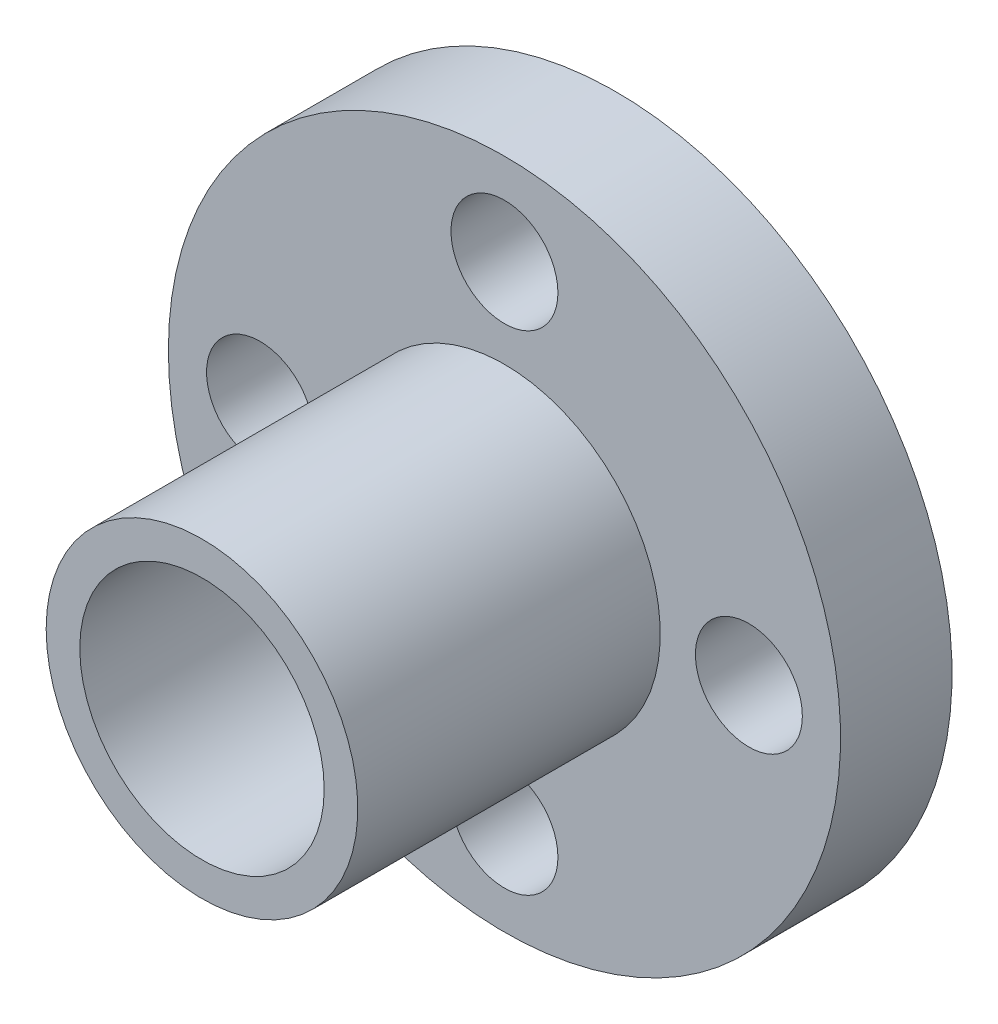
ISO-10303-21;
HEADER;
FILE_DESCRIPTION(('STEP AP214'),'2;1');
FILE_NAME('part.step','',(''),(''),'','','');
FILE_SCHEMA(('AUTOMOTIVE_DESIGN { 1 0 10303 214 1 1 1 1 }'));
ENDSEC;
DATA;
#1=APPLICATION_CONTEXT('core data for automotive mechanical design processes');
#2=APPLICATION_PROTOCOL_DEFINITION('international standard','automotive_design',2000,#1);
#3=PRODUCT_CONTEXT('',#1,'mechanical');
#4=PRODUCT('Part','Part','',(#3));
#5=PRODUCT_RELATED_PRODUCT_CATEGORY('part','',(#4));
#6=PRODUCT_DEFINITION_FORMATION('','',#4);
#7=PRODUCT_DEFINITION_CONTEXT('part definition',#1,'design');
#8=PRODUCT_DEFINITION('design','',#6,#7);
#9=PRODUCT_DEFINITION_SHAPE('','',#8);
#10=(LENGTH_UNIT() NAMED_UNIT(*) SI_UNIT(.MILLI.,.METRE.));
#11=(NAMED_UNIT(*) PLANE_ANGLE_UNIT() SI_UNIT($,.RADIAN.));
#12=(NAMED_UNIT(*) SI_UNIT($,.STERADIAN.) SOLID_ANGLE_UNIT());
#13=UNCERTAINTY_MEASURE_WITH_UNIT(LENGTH_MEASURE(1.E-05),#10,'distance_accuracy_value','');
#14=(GEOMETRIC_REPRESENTATION_CONTEXT(3) GLOBAL_UNCERTAINTY_ASSIGNED_CONTEXT((#13)) GLOBAL_UNIT_ASSIGNED_CONTEXT((#10,
#11,#12)) REPRESENTATION_CONTEXT('',''));
#15=CARTESIAN_POINT('',(0.,0.,0.));
#16=DIRECTION('',(0.,0.,1.));
#17=DIRECTION('',(1.,0.,0.));
#18=AXIS2_PLACEMENT_3D('',#15,#16,#17);
#19=CARTESIAN_POINT('',(11.,0.,5.15));
#20=DIRECTION('',(0.,0.,-1.));
#21=DIRECTION('',(-1.,0.,0.));
#22=AXIS2_PLACEMENT_3D('',#19,#20,#21);
#23=PLANE('',#22);
#24=CARTESIAN_POINT('',(0.,8.,5.15));
#25=DIRECTION('',(0.,0.,1.));
#26=DIRECTION('',(1.,0.,0.));
#27=AXIS2_PLACEMENT_3D('',#24,#25,#26);
#28=CIRCLE('',#27,1.75);
#29=CARTESIAN_POINT('',(1.75,8.,5.15));
#30=VERTEX_POINT('',#29);
#31=EDGE_CURVE('E85',#30,#30,#28,.T.);
#32=ORIENTED_EDGE('',*,*,#31,.F.);
#33=EDGE_LOOP('',(#32));
#34=FACE_BOUND('',#33,.T.);
#35=CARTESIAN_POINT('',(8.,0.,5.15));
#36=DIRECTION('',(0.,0.,1.));
#37=DIRECTION('',(1.,0.,0.));
#38=AXIS2_PLACEMENT_3D('',#35,#36,#37);
#39=CIRCLE('',#38,1.75);
#40=CARTESIAN_POINT('',(9.75,0.,5.15));
#41=VERTEX_POINT('',#40);
#42=EDGE_CURVE('E71',#41,#41,#39,.T.);
#43=ORIENTED_EDGE('',*,*,#42,.F.);
#44=EDGE_LOOP('',(#43));
#45=FACE_BOUND('',#44,.T.);
#46=CARTESIAN_POINT('',(-8.,0.,5.15));
#47=DIRECTION('',(0.,0.,1.));
#48=DIRECTION('',(1.,0.,0.));
#49=AXIS2_PLACEMENT_3D('',#46,#47,#48);
#50=CIRCLE('',#49,1.75);
#51=CARTESIAN_POINT('',(-6.25,0.,5.15));
#52=VERTEX_POINT('',#51);
#53=EDGE_CURVE('E66',#52,#52,#50,.T.);
#54=ORIENTED_EDGE('',*,*,#53,.F.);
#55=EDGE_LOOP('',(#54));
#56=FACE_BOUND('',#55,.T.);
#57=CARTESIAN_POINT('',(0.,0.,5.15));
#58=DIRECTION('',(0.,0.,-1.));
#59=DIRECTION('',(-1.,0.,0.));
#60=AXIS2_PLACEMENT_3D('',#57,#58,#59);
#61=CIRCLE('',#60,11.);
#62=CARTESIAN_POINT('',(-11.,0.,5.15));
#63=VERTEX_POINT('',#62);
#64=EDGE_CURVE('E52',#63,#63,#61,.T.);
#65=ORIENTED_EDGE('',*,*,#64,.F.);
#66=EDGE_LOOP('',(#65));
#67=FACE_BOUND('',#66,.T.);
#68=CARTESIAN_POINT('',(0.,0.,5.15));
#69=DIRECTION('',(0.,0.,-1.));
#70=DIRECTION('',(-1.,0.,0.));
#71=AXIS2_PLACEMENT_3D('',#68,#69,#70);
#72=CIRCLE('',#71,5.1);
#73=CARTESIAN_POINT('',(-5.1,0.,5.15));
#74=VERTEX_POINT('',#73);
#75=EDGE_CURVE('E58',#74,#74,#72,.T.);
#76=ORIENTED_EDGE('',*,*,#75,.T.);
#77=EDGE_LOOP('',(#76));
#78=FACE_BOUND('',#77,.T.);
#79=CARTESIAN_POINT('',(0.,-8.,5.15));
#80=DIRECTION('',(0.,0.,1.));
#81=DIRECTION('',(1.,0.,0.));
#82=AXIS2_PLACEMENT_3D('',#79,#80,#81);
#83=CIRCLE('',#82,1.75);
#84=CARTESIAN_POINT('',(1.75,-8.,5.15));
#85=VERTEX_POINT('',#84);
#86=EDGE_CURVE('E70',#85,#85,#83,.T.);
#87=ORIENTED_EDGE('',*,*,#86,.F.);
#88=EDGE_LOOP('',(#87));
#89=FACE_BOUND('',#88,.T.);
#90=ADVANCED_FACE('F43',(#34,#45,#56,#67,#78,#89),#23,.F.);
#91=CARTESIAN_POINT('',(11.,0.,1.5));
#92=DIRECTION('',(0.,0.,1.));
#93=DIRECTION('',(1.,0.,0.));
#94=AXIS2_PLACEMENT_3D('',#91,#92,#93);
#95=PLANE('',#94);
#96=CARTESIAN_POINT('',(0.,8.,1.5));
#97=DIRECTION('',(0.,0.,1.));
#98=DIRECTION('',(1.,0.,0.));
#99=AXIS2_PLACEMENT_3D('',#96,#97,#98);
#100=CIRCLE('',#99,1.75);
#101=CARTESIAN_POINT('',(1.75,8.,1.5));
#102=VERTEX_POINT('',#101);
#103=EDGE_CURVE('E47',#102,#102,#100,.T.);
#104=ORIENTED_EDGE('',*,*,#103,.T.);
#105=EDGE_LOOP('',(#104));
#106=FACE_BOUND('',#105,.T.);
#107=CARTESIAN_POINT('',(8.,0.,1.5));
#108=DIRECTION('',(0.,0.,1.));
#109=DIRECTION('',(1.,0.,0.));
#110=AXIS2_PLACEMENT_3D('',#107,#108,#109);
#111=CIRCLE('',#110,1.75);
#112=CARTESIAN_POINT('',(9.75,0.,1.5));
#113=VERTEX_POINT('',#112);
#114=EDGE_CURVE('E67',#113,#113,#111,.T.);
#115=ORIENTED_EDGE('',*,*,#114,.T.);
#116=EDGE_LOOP('',(#115));
#117=FACE_BOUND('',#116,.T.);
#118=CARTESIAN_POINT('',(0.,-8.,1.5));
#119=DIRECTION('',(0.,0.,1.));
#120=DIRECTION('',(1.,0.,0.));
#121=AXIS2_PLACEMENT_3D('',#118,#119,#120);
#122=CIRCLE('',#121,1.75);
#123=CARTESIAN_POINT('',(1.75,-8.,1.5));
#124=VERTEX_POINT('',#123);
#125=EDGE_CURVE('E77',#124,#124,#122,.T.);
#126=ORIENTED_EDGE('',*,*,#125,.T.);
#127=EDGE_LOOP('',(#126));
#128=FACE_BOUND('',#127,.T.);
#129=CARTESIAN_POINT('',(-8.,0.,1.5));
#130=DIRECTION('',(0.,0.,1.));
#131=DIRECTION('',(1.,0.,0.));
#132=AXIS2_PLACEMENT_3D('',#129,#130,#131);
#133=CIRCLE('',#132,1.75);
#134=CARTESIAN_POINT('',(-6.25,0.,1.5));
#135=VERTEX_POINT('',#134);
#136=EDGE_CURVE('E62',#135,#135,#133,.T.);
#137=ORIENTED_EDGE('',*,*,#136,.T.);
#138=EDGE_LOOP('',(#137));
#139=FACE_BOUND('',#138,.T.);
#140=CARTESIAN_POINT('',(0.,0.,1.5));
#141=DIRECTION('',(0.,0.,-1.));
#142=DIRECTION('',(-1.,0.,0.));
#143=AXIS2_PLACEMENT_3D('',#140,#141,#142);
#144=CIRCLE('',#143,5.1);
#145=CARTESIAN_POINT('',(-5.1,0.,1.5));
#146=VERTEX_POINT('',#145);
#147=EDGE_CURVE('E65',#146,#146,#144,.T.);
#148=ORIENTED_EDGE('',*,*,#147,.F.);
#149=EDGE_LOOP('',(#148));
#150=FACE_BOUND('',#149,.T.);
#151=CARTESIAN_POINT('',(0.,0.,1.5));
#152=DIRECTION('',(0.,0.,-1.));
#153=DIRECTION('',(-1.,0.,0.));
#154=AXIS2_PLACEMENT_3D('',#151,#152,#153);
#155=CIRCLE('',#154,11.);
#156=CARTESIAN_POINT('',(-11.,0.,1.5));
#157=VERTEX_POINT('',#156);
#158=EDGE_CURVE('E10',#157,#157,#155,.T.);
#159=ORIENTED_EDGE('',*,*,#158,.T.);
#160=EDGE_LOOP('',(#159));
#161=FACE_BOUND('',#160,.T.);
#162=ADVANCED_FACE('F45',(#106,#117,#128,#139,#150,#161),#95,.F.);
#163=CARTESIAN_POINT('',(0.,0.,0.));
#164=DIRECTION('',(0.,0.,-1.));
#165=DIRECTION('',(-1.,0.,0.));
#166=AXIS2_PLACEMENT_3D('',#163,#164,#165);
#167=CYLINDRICAL_SURFACE('',#166,11.);
#168=ORIENTED_EDGE('',*,*,#158,.F.);
#169=EDGE_LOOP('',(#168));
#170=FACE_BOUND('',#169,.T.);
#171=ORIENTED_EDGE('',*,*,#64,.T.);
#172=EDGE_LOOP('',(#171));
#173=FACE_BOUND('',#172,.T.);
#174=ADVANCED_FACE('F122',(#170,#173),#167,.T.);
#175=CARTESIAN_POINT('',(0.,0.,0.));
#176=DIRECTION('',(0.,0.,-1.));
#177=DIRECTION('',(-1.,0.,0.));
#178=AXIS2_PLACEMENT_3D('',#175,#176,#177);
#179=CYLINDRICAL_SURFACE('',#178,5.1);
#180=ORIENTED_EDGE('',*,*,#75,.F.);
#181=EDGE_LOOP('',(#180));
#182=FACE_BOUND('',#181,.T.);
#183=CARTESIAN_POINT('',(0.,0.,15.05));
#184=DIRECTION('',(0.,0.,-1.));
#185=DIRECTION('',(-1.,0.,0.));
#186=AXIS2_PLACEMENT_3D('',#183,#184,#185);
#187=CIRCLE('',#186,5.1);
#188=CARTESIAN_POINT('',(-5.1,0.,15.05));
#189=VERTEX_POINT('',#188);
#190=EDGE_CURVE('E109',#189,#189,#187,.T.);
#191=ORIENTED_EDGE('',*,*,#190,.T.);
#192=EDGE_LOOP('',(#191));
#193=FACE_BOUND('',#192,.T.);
#194=ADVANCED_FACE('F118',(#182,#193),#179,.T.);
#195=CARTESIAN_POINT('',(5.1,0.,15.05));
#196=DIRECTION('',(0.,0.,-1.));
#197=DIRECTION('',(-1.,0.,0.));
#198=AXIS2_PLACEMENT_3D('',#195,#196,#197);
#199=PLANE('',#198);
#200=ORIENTED_EDGE('',*,*,#190,.F.);
#201=EDGE_LOOP('',(#200));
#202=FACE_BOUND('',#201,.T.);
#203=CARTESIAN_POINT('',(0.,0.,15.05));
#204=DIRECTION('',(0.,0.,-1.));
#205=DIRECTION('',(-1.,0.,0.));
#206=AXIS2_PLACEMENT_3D('',#203,#204,#205);
#207=CIRCLE('',#206,4.);
#208=CARTESIAN_POINT('',(-4.,0.,15.05));
#209=VERTEX_POINT('',#208);
#210=EDGE_CURVE('E105',#209,#209,#207,.T.);
#211=ORIENTED_EDGE('',*,*,#210,.T.);
#212=EDGE_LOOP('',(#211));
#213=FACE_BOUND('',#212,.T.);
#214=ADVANCED_FACE('F121',(#202,#213),#199,.F.);
#215=CARTESIAN_POINT('',(0.,0.,0.));
#216=DIRECTION('',(0.,0.,-1.));
#217=DIRECTION('',(-1.,0.,0.));
#218=AXIS2_PLACEMENT_3D('',#215,#216,#217);
#219=CYLINDRICAL_SURFACE('',#218,4.);
#220=ORIENTED_EDGE('',*,*,#210,.F.);
#221=EDGE_LOOP('',(#220));
#222=FACE_BOUND('',#221,.T.);
#223=CARTESIAN_POINT('',(0.,0.,0.));
#224=DIRECTION('',(0.,0.,-1.));
#225=DIRECTION('',(-1.,0.,0.));
#226=AXIS2_PLACEMENT_3D('',#223,#224,#225);
#227=CIRCLE('',#226,4.);
#228=CARTESIAN_POINT('',(-4.,0.,0.));
#229=VERTEX_POINT('',#228);
#230=EDGE_CURVE('E101',#229,#229,#227,.T.);
#231=ORIENTED_EDGE('',*,*,#230,.T.);
#232=EDGE_LOOP('',(#231));
#233=FACE_BOUND('',#232,.T.);
#234=ADVANCED_FACE('F128',(#222,#233),#219,.F.);
#235=CARTESIAN_POINT('',(5.1,0.,0.));
#236=DIRECTION('',(0.,0.,1.));
#237=DIRECTION('',(1.,0.,0.));
#238=AXIS2_PLACEMENT_3D('',#235,#236,#237);
#239=PLANE('',#238);
#240=ORIENTED_EDGE('',*,*,#230,.F.);
#241=EDGE_LOOP('',(#240));
#242=FACE_BOUND('',#241,.T.);
#243=CARTESIAN_POINT('',(0.,0.,0.));
#244=DIRECTION('',(0.,0.,-1.));
#245=DIRECTION('',(-1.,0.,0.));
#246=AXIS2_PLACEMENT_3D('',#243,#244,#245);
#247=CIRCLE('',#246,5.1);
#248=CARTESIAN_POINT('',(-5.1,0.,0.));
#249=VERTEX_POINT('',#248);
#250=EDGE_CURVE('E97',#249,#249,#247,.T.);
#251=ORIENTED_EDGE('',*,*,#250,.T.);
#252=EDGE_LOOP('',(#251));
#253=FACE_BOUND('',#252,.T.);
#254=ADVANCED_FACE('F134',(#242,#253),#239,.F.);
#255=CARTESIAN_POINT('',(0.,0.,0.));
#256=DIRECTION('',(0.,0.,-1.));
#257=DIRECTION('',(-1.,0.,0.));
#258=AXIS2_PLACEMENT_3D('',#255,#256,#257);
#259=CYLINDRICAL_SURFACE('',#258,5.1);
#260=ORIENTED_EDGE('',*,*,#250,.F.);
#261=EDGE_LOOP('',(#260));
#262=FACE_BOUND('',#261,.T.);
#263=ORIENTED_EDGE('',*,*,#147,.T.);
#264=EDGE_LOOP('',(#263));
#265=FACE_BOUND('',#264,.T.);
#266=ADVANCED_FACE('F140',(#262,#265),#259,.T.);
#267=CARTESIAN_POINT('',(-8.,0.,5.15));
#268=DIRECTION('',(0.,0.,1.));
#269=DIRECTION('',(1.,0.,0.));
#270=AXIS2_PLACEMENT_3D('',#267,#268,#269);
#271=CYLINDRICAL_SURFACE('',#270,1.75);
#272=ORIENTED_EDGE('',*,*,#53,.T.);
#273=EDGE_LOOP('',(#272));
#274=FACE_BOUND('',#273,.T.);
#275=ORIENTED_EDGE('',*,*,#136,.F.);
#276=EDGE_LOOP('',(#275));
#277=FACE_BOUND('',#276,.T.);
#278=ADVANCED_FACE('F146',(#274,#277),#271,.F.);
#279=CARTESIAN_POINT('',(0.,-8.,5.15));
#280=DIRECTION('',(0.,0.,1.));
#281=DIRECTION('',(1.,0.,0.));
#282=AXIS2_PLACEMENT_3D('',#279,#280,#281);
#283=CYLINDRICAL_SURFACE('',#282,1.75);
#284=ORIENTED_EDGE('',*,*,#86,.T.);
#285=EDGE_LOOP('',(#284));
#286=FACE_BOUND('',#285,.T.);
#287=ORIENTED_EDGE('',*,*,#125,.F.);
#288=EDGE_LOOP('',(#287));
#289=FACE_BOUND('',#288,.T.);
#290=ADVANCED_FACE('F166',(#286,#289),#283,.F.);
#291=CARTESIAN_POINT('',(8.,0.,5.15));
#292=DIRECTION('',(0.,0.,1.));
#293=DIRECTION('',(1.,0.,0.));
#294=AXIS2_PLACEMENT_3D('',#291,#292,#293);
#295=CYLINDRICAL_SURFACE('',#294,1.75);
#296=ORIENTED_EDGE('',*,*,#42,.T.);
#297=EDGE_LOOP('',(#296));
#298=FACE_BOUND('',#297,.T.);
#299=ORIENTED_EDGE('',*,*,#114,.F.);
#300=EDGE_LOOP('',(#299));
#301=FACE_BOUND('',#300,.T.);
#302=ADVANCED_FACE('F172',(#298,#301),#295,.F.);
#303=CARTESIAN_POINT('',(0.,8.,5.15));
#304=DIRECTION('',(0.,0.,1.));
#305=DIRECTION('',(1.,0.,0.));
#306=AXIS2_PLACEMENT_3D('',#303,#304,#305);
#307=CYLINDRICAL_SURFACE('',#306,1.75);
#308=ORIENTED_EDGE('',*,*,#31,.T.);
#309=EDGE_LOOP('',(#308));
#310=FACE_BOUND('',#309,.T.);
#311=ORIENTED_EDGE('',*,*,#103,.F.);
#312=EDGE_LOOP('',(#311));
#313=FACE_BOUND('',#312,.T.);
#314=ADVANCED_FACE('F178',(#310,#313),#307,.F.);
#315=CLOSED_SHELL('',(#90,#162,#174,#194,#214,#234,#254,#266,#278,#290,#302,#314));
#316=MANIFOLD_SOLID_BREP('B2',#315);
#317=ADVANCED_BREP_SHAPE_REPRESENTATION('',(#18,#316),#14);
#318=SHAPE_DEFINITION_REPRESENTATION(#9,#317);
ENDSEC;
END-ISO-10303-21;
